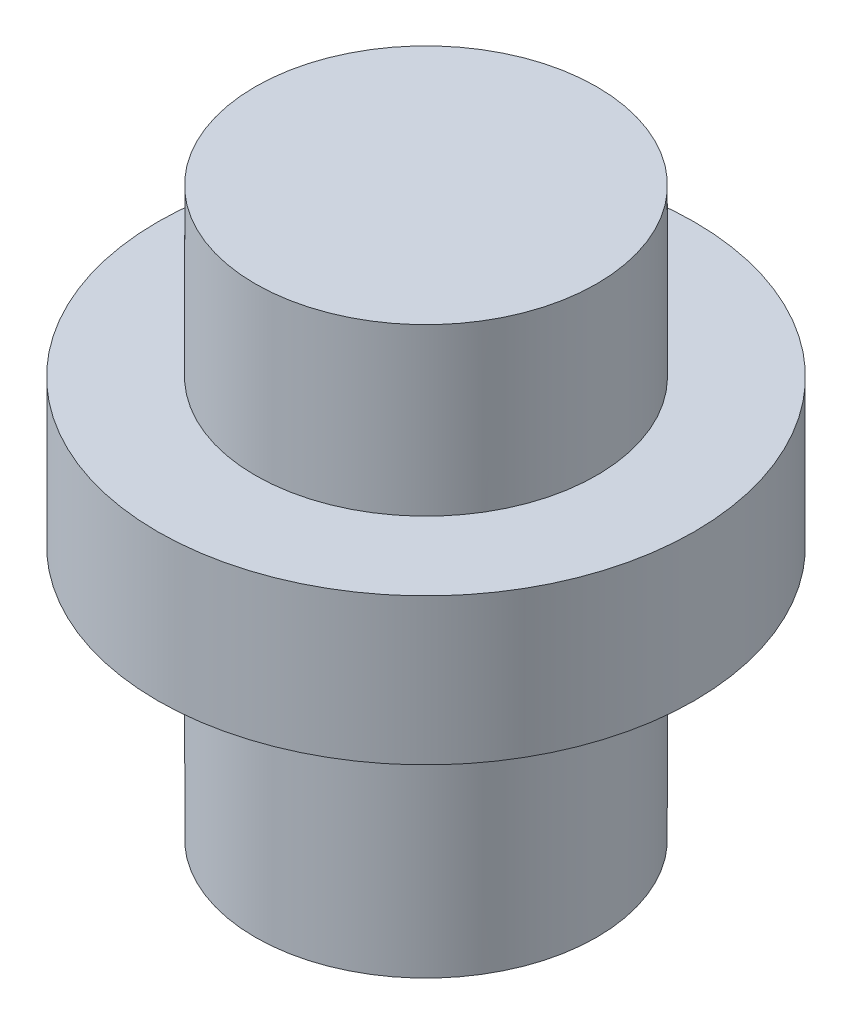
ISO-10303-21;
HEADER;
FILE_DESCRIPTION(('STEP AP214'),'2;1');
FILE_NAME('part.step','',(''),(''),'','','');
FILE_SCHEMA(('AUTOMOTIVE_DESIGN { 1 0 10303 214 1 1 1 1 }'));
ENDSEC;
DATA;
#1=APPLICATION_CONTEXT('core data for automotive mechanical design processes');
#2=APPLICATION_PROTOCOL_DEFINITION('international standard','automotive_design',2000,#1);
#3=PRODUCT_CONTEXT('',#1,'mechanical');
#4=PRODUCT('Part','Part','',(#3));
#5=PRODUCT_RELATED_PRODUCT_CATEGORY('part','',(#4));
#6=PRODUCT_DEFINITION_FORMATION('','',#4);
#7=PRODUCT_DEFINITION_CONTEXT('part definition',#1,'design');
#8=PRODUCT_DEFINITION('design','',#6,#7);
#9=PRODUCT_DEFINITION_SHAPE('','',#8);
#10=(LENGTH_UNIT() NAMED_UNIT(*) SI_UNIT(.MILLI.,.METRE.));
#11=(NAMED_UNIT(*) PLANE_ANGLE_UNIT() SI_UNIT($,.RADIAN.));
#12=(NAMED_UNIT(*) SI_UNIT($,.STERADIAN.) SOLID_ANGLE_UNIT());
#13=UNCERTAINTY_MEASURE_WITH_UNIT(LENGTH_MEASURE(1.E-05),#10,'distance_accuracy_value','');
#14=(GEOMETRIC_REPRESENTATION_CONTEXT(3) GLOBAL_UNCERTAINTY_ASSIGNED_CONTEXT((#13)) GLOBAL_UNIT_ASSIGNED_CONTEXT((#10,
#11,#12)) REPRESENTATION_CONTEXT('',''));
#15=CARTESIAN_POINT('',(0.,0.,0.));
#16=DIRECTION('',(0.,0.,1.));
#17=DIRECTION('',(1.,0.,0.));
#18=AXIS2_PLACEMENT_3D('',#15,#16,#17);
#19=CARTESIAN_POINT('',(24.0914108515431,-14.35,-9.54622091284926));
#20=DIRECTION('',(0.,1.,0.));
#21=DIRECTION('',(0.,0.,1.));
#22=AXIS2_PLACEMENT_3D('',#19,#20,#21);
#23=CYLINDRICAL_SURFACE('',#22,1.75);
#24=CARTESIAN_POINT('',(24.0914108515431,-14.35,-9.54622091284926));
#25=DIRECTION('',(0.,-1.,0.));
#26=DIRECTION('',(0.,0.,-1.));
#27=AXIS2_PLACEMENT_3D('',#24,#25,#26);
#28=CIRCLE('',#27,1.75);
#29=CARTESIAN_POINT('',(24.0914108515431,-14.35,-11.2962209128493));
#30=VERTEX_POINT('',#29);
#31=EDGE_CURVE('E60',#30,#30,#28,.T.);
#32=ORIENTED_EDGE('',*,*,#31,.F.);
#33=EDGE_LOOP('',(#32));
#34=FACE_BOUND('',#33,.T.);
#35=CARTESIAN_POINT('',(24.0914108515431,-11.75,-9.54622091284926));
#36=DIRECTION('',(0.,1.,0.));
#37=DIRECTION('',(0.,0.,1.));
#38=AXIS2_PLACEMENT_3D('',#35,#36,#37);
#39=CIRCLE('',#38,1.75);
#40=CARTESIAN_POINT('',(24.0914108515431,-11.75,-7.79622091284926));
#41=VERTEX_POINT('',#40);
#42=EDGE_CURVE('E11',#41,#41,#39,.T.);
#43=ORIENTED_EDGE('',*,*,#42,.F.);
#44=EDGE_LOOP('',(#43));
#45=FACE_BOUND('',#44,.T.);
#46=ADVANCED_FACE('F47',(#34,#45),#23,.T.);
#47=CARTESIAN_POINT('',(24.0914108515431,-14.35,-9.54622091284926));
#48=DIRECTION('',(0.,-1.,0.));
#49=DIRECTION('',(0.,0.,-1.));
#50=AXIS2_PLACEMENT_3D('',#47,#48,#49);
#51=PLANE('',#50);
#52=ORIENTED_EDGE('',*,*,#31,.T.);
#53=EDGE_LOOP('',(#52));
#54=FACE_BOUND('',#53,.T.);
#55=ADVANCED_FACE('F94',(#54),#51,.T.);
#56=CARTESIAN_POINT('',(24.0914108515431,-11.75,-9.54622091284926));
#57=DIRECTION('',(0.,1.,0.));
#58=DIRECTION('',(0.,0.,1.));
#59=AXIS2_PLACEMENT_3D('',#56,#57,#58);
#60=CYLINDRICAL_SURFACE('',#59,2.75);
#61=CARTESIAN_POINT('',(24.0914108515431,-11.75,-9.54622091284926));
#62=DIRECTION('',(0.,1.,0.));
#63=DIRECTION('',(1.,0.,0.));
#64=AXIS2_PLACEMENT_3D('',#61,#62,#63);
#65=CIRCLE('',#64,2.75);
#66=CARTESIAN_POINT('',(26.8414108515431,-11.75,-9.54622091284926));
#67=VERTEX_POINT('',#66);
#68=EDGE_CURVE('E69',#67,#67,#65,.T.);
#69=ORIENTED_EDGE('',*,*,#68,.T.);
#70=EDGE_LOOP('',(#69));
#71=FACE_BOUND('',#70,.T.);
#72=CARTESIAN_POINT('',(24.0914108515431,-10.25,-9.54622091284926));
#73=DIRECTION('',(0.,1.,0.));
#74=DIRECTION('',(1.,0.,0.));
#75=AXIS2_PLACEMENT_3D('',#72,#73,#74);
#76=CIRCLE('',#75,2.75);
#77=CARTESIAN_POINT('',(26.8414108515431,-10.25,-9.54622091284926));
#78=VERTEX_POINT('',#77);
#79=EDGE_CURVE('E75',#78,#78,#76,.T.);
#80=ORIENTED_EDGE('',*,*,#79,.F.);
#81=EDGE_LOOP('',(#80));
#82=FACE_BOUND('',#81,.T.);
#83=ADVANCED_FACE('F95',(#71,#82),#60,.T.);
#84=CARTESIAN_POINT('',(24.0914108515431,-11.75,-9.54622091284926));
#85=DIRECTION('',(0.,1.,0.));
#86=DIRECTION('',(0.,0.,1.));
#87=AXIS2_PLACEMENT_3D('',#84,#85,#86);
#88=PLANE('',#87);
#89=ORIENTED_EDGE('',*,*,#42,.T.);
#90=EDGE_LOOP('',(#89));
#91=FACE_BOUND('',#90,.T.);
#92=ORIENTED_EDGE('',*,*,#68,.F.);
#93=EDGE_LOOP('',(#92));
#94=FACE_BOUND('',#93,.T.);
#95=ADVANCED_FACE('F86',(#91,#94),#88,.F.);
#96=CARTESIAN_POINT('',(24.0914108515431,-10.25,-9.54622091284926));
#97=DIRECTION('',(0.,1.,0.));
#98=DIRECTION('',(0.,0.,1.));
#99=AXIS2_PLACEMENT_3D('',#96,#97,#98);
#100=PLANE('',#99);
#101=CARTESIAN_POINT('',(24.0914108515431,-10.25,-9.54622091284926));
#102=DIRECTION('',(0.,1.,0.));
#103=DIRECTION('',(0.,0.,1.));
#104=AXIS2_PLACEMENT_3D('',#101,#102,#103);
#105=CIRCLE('',#104,1.75);
#106=CARTESIAN_POINT('',(24.0914108515431,-10.25,-7.79622091284926));
#107=VERTEX_POINT('',#106);
#108=EDGE_CURVE('E76',#107,#107,#105,.T.);
#109=ORIENTED_EDGE('',*,*,#108,.F.);
#110=EDGE_LOOP('',(#109));
#111=FACE_BOUND('',#110,.T.);
#112=ORIENTED_EDGE('',*,*,#79,.T.);
#113=EDGE_LOOP('',(#112));
#114=FACE_BOUND('',#113,.T.);
#115=ADVANCED_FACE('F82',(#111,#114),#100,.T.);
#116=CARTESIAN_POINT('',(24.0914108515431,-8.55,-9.54622091284926));
#117=DIRECTION('',(0.,-1.,0.));
#118=DIRECTION('',(0.,0.,-1.));
#119=AXIS2_PLACEMENT_3D('',#116,#117,#118);
#120=PLANE('',#119);
#121=CARTESIAN_POINT('',(24.0914108515431,-8.55,-9.54622091284926));
#122=DIRECTION('',(0.,-1.,0.));
#123=DIRECTION('',(0.,0.,-1.));
#124=AXIS2_PLACEMENT_3D('',#121,#122,#123);
#125=CIRCLE('',#124,1.75);
#126=CARTESIAN_POINT('',(24.0914108515431,-8.55,-11.2962209128493));
#127=VERTEX_POINT('',#126);
#128=EDGE_CURVE('E64',#127,#127,#125,.T.);
#129=ORIENTED_EDGE('',*,*,#128,.F.);
#130=EDGE_LOOP('',(#129));
#131=FACE_BOUND('',#130,.T.);
#132=ADVANCED_FACE('F87',(#131),#120,.F.);
#133=ORIENTED_EDGE('',*,*,#108,.T.);
#134=EDGE_LOOP('',(#133));
#135=FACE_BOUND('',#134,.T.);
#136=ORIENTED_EDGE('',*,*,#128,.T.);
#137=EDGE_LOOP('',(#136));
#138=FACE_BOUND('',#137,.T.);
#139=ADVANCED_FACE('F51',(#135,#138),#23,.T.);
#140=CLOSED_SHELL('',(#46,#55,#83,#95,#115,#132,#139));
#141=MANIFOLD_SOLID_BREP('B2',#140);
#142=ADVANCED_BREP_SHAPE_REPRESENTATION('',(#18,#141),#14);
#143=SHAPE_DEFINITION_REPRESENTATION(#9,#142);
ENDSEC;
END-ISO-10303-21;
